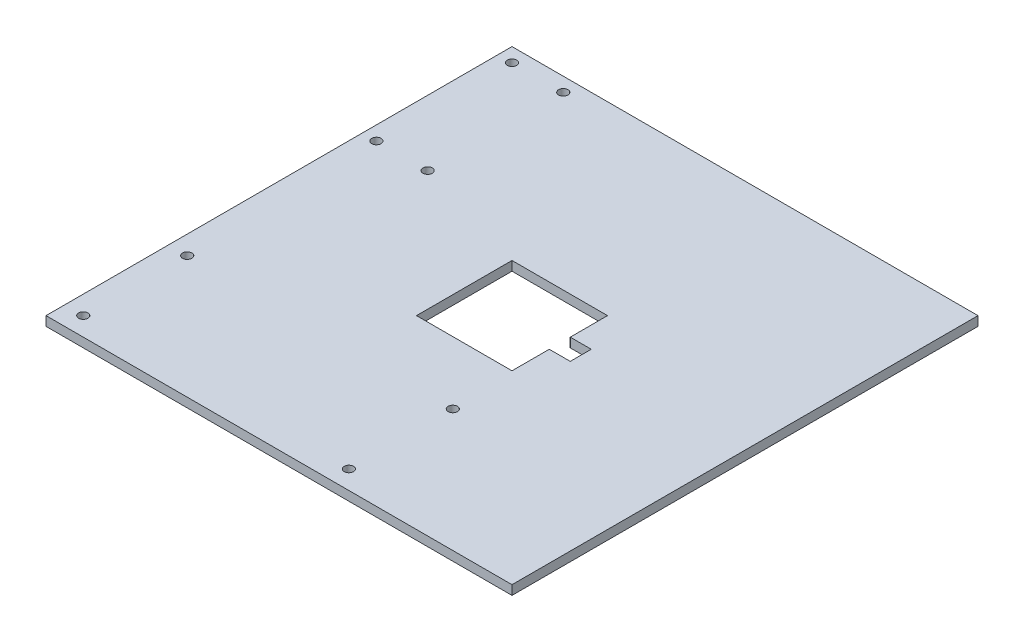
ISO-10303-21;
HEADER;
FILE_DESCRIPTION(('STEP AP214'),'2;1');
FILE_NAME('part.step','',(''),(''),'','','');
FILE_SCHEMA(('AUTOMOTIVE_DESIGN { 1 0 10303 214 1 1 1 1 }'));
ENDSEC;
DATA;
#1=APPLICATION_CONTEXT('core data for automotive mechanical design processes');
#2=APPLICATION_PROTOCOL_DEFINITION('international standard','automotive_design',2000,#1);
#3=PRODUCT_CONTEXT('',#1,'mechanical');
#4=PRODUCT('Part','Part','',(#3));
#5=PRODUCT_RELATED_PRODUCT_CATEGORY('part','',(#4));
#6=PRODUCT_DEFINITION_FORMATION('','',#4);
#7=PRODUCT_DEFINITION_CONTEXT('part definition',#1,'design');
#8=PRODUCT_DEFINITION('design','',#6,#7);
#9=PRODUCT_DEFINITION_SHAPE('','',#8);
#10=(LENGTH_UNIT() NAMED_UNIT(*) SI_UNIT(.MILLI.,.METRE.));
#11=(NAMED_UNIT(*) PLANE_ANGLE_UNIT() SI_UNIT($,.RADIAN.));
#12=(NAMED_UNIT(*) SI_UNIT($,.STERADIAN.) SOLID_ANGLE_UNIT());
#13=UNCERTAINTY_MEASURE_WITH_UNIT(LENGTH_MEASURE(1.E-05),#10,'distance_accuracy_value','');
#14=(GEOMETRIC_REPRESENTATION_CONTEXT(3) GLOBAL_UNCERTAINTY_ASSIGNED_CONTEXT((#13)) GLOBAL_UNIT_ASSIGNED_CONTEXT((#10,
#11,#12)) REPRESENTATION_CONTEXT('',''));
#15=CARTESIAN_POINT('',(0.,0.,0.));
#16=DIRECTION('',(0.,0.,1.));
#17=DIRECTION('',(1.,0.,0.));
#18=AXIS2_PLACEMENT_3D('',#15,#16,#17);
#19=CARTESIAN_POINT('',(0.,2.,0.));
#20=DIRECTION('',(0.,-1.,0.));
#21=DIRECTION('',(0.,0.,-1.));
#22=AXIS2_PLACEMENT_3D('',#19,#20,#21);
#23=PLANE('',#22);
#24=CARTESIAN_POINT('',(3.,2.,-97.));
#25=DIRECTION('',(0.,1.,0.));
#26=DIRECTION('',(0.,0.,1.));
#27=AXIS2_PLACEMENT_3D('',#24,#25,#26);
#28=CIRCLE('',#27,1.);
#29=CARTESIAN_POINT('',(3.,2.,-96.));
#30=VERTEX_POINT('',#29);
#31=EDGE_CURVE('E426',#30,#30,#28,.T.);
#32=ORIENTED_EDGE('',*,*,#31,.F.);
#33=EDGE_LOOP('',(#32));
#34=FACE_BOUND('',#33,.T.);
#35=CARTESIAN_POINT('',(14.,2.,-97.));
#36=DIRECTION('',(0.,1.,0.));
#37=DIRECTION('',(0.,0.,1.));
#38=AXIS2_PLACEMENT_3D('',#35,#36,#37);
#39=CIRCLE('',#38,1.);
#40=CARTESIAN_POINT('',(14.,2.,-96.));
#41=VERTEX_POINT('',#40);
#42=EDGE_CURVE('E428',#41,#41,#39,.T.);
#43=ORIENTED_EDGE('',*,*,#42,.F.);
#44=EDGE_LOOP('',(#43));
#45=FACE_BOUND('',#44,.T.);
#46=CARTESIAN_POINT('',(14.,2.,-67.9));
#47=DIRECTION('',(0.,1.,0.));
#48=DIRECTION('',(0.,0.,1.));
#49=AXIS2_PLACEMENT_3D('',#46,#47,#48);
#50=CIRCLE('',#49,1.);
#51=CARTESIAN_POINT('',(14.,2.,-66.9));
#52=VERTEX_POINT('',#51);
#53=EDGE_CURVE('E481',#52,#52,#50,.T.);
#54=ORIENTED_EDGE('',*,*,#53,.F.);
#55=EDGE_LOOP('',(#54));
#56=FACE_BOUND('',#55,.T.);
#57=CARTESIAN_POINT('',(3.,2.,-67.9));
#58=DIRECTION('',(0.,1.,0.));
#59=DIRECTION('',(0.,0.,1.));
#60=AXIS2_PLACEMENT_3D('',#57,#58,#59);
#61=CIRCLE('',#60,1.);
#62=CARTESIAN_POINT('',(3.,2.,-66.9));
#63=VERTEX_POINT('',#62);
#64=EDGE_CURVE('E436',#63,#63,#61,.T.);
#65=ORIENTED_EDGE('',*,*,#64,.F.);
#66=EDGE_LOOP('',(#65));
#67=FACE_BOUND('',#66,.T.);
#68=CARTESIAN_POINT('',(4.,2.,-4.));
#69=DIRECTION('',(0.,1.,0.));
#70=DIRECTION('',(0.,0.,1.));
#71=AXIS2_PLACEMENT_3D('',#68,#69,#70);
#72=CIRCLE('',#71,0.999999999999998);
#73=CARTESIAN_POINT('',(4.,2.,-3.));
#74=VERTEX_POINT('',#73);
#75=EDGE_CURVE('E450',#74,#74,#72,.T.);
#76=ORIENTED_EDGE('',*,*,#75,.F.);
#77=EDGE_LOOP('',(#76));
#78=FACE_BOUND('',#77,.T.);
#79=CARTESIAN_POINT('',(61.,2.,-26.3));
#80=DIRECTION('',(0.,1.,0.));
#81=DIRECTION('',(0.,0.,1.));
#82=AXIS2_PLACEMENT_3D('',#79,#80,#81);
#83=CIRCLE('',#82,0.999999999999998);
#84=CARTESIAN_POINT('',(61.,2.,-25.3));
#85=VERTEX_POINT('',#84);
#86=EDGE_CURVE('E443',#85,#85,#83,.T.);
#87=ORIENTED_EDGE('',*,*,#86,.F.);
#88=EDGE_LOOP('',(#87));
#89=FACE_BOUND('',#88,.T.);
#90=CARTESIAN_POINT('',(61.,2.,-4.));
#91=DIRECTION('',(0.,1.,0.));
#92=DIRECTION('',(0.,0.,1.));
#93=AXIS2_PLACEMENT_3D('',#90,#91,#92);
#94=CIRCLE('',#93,0.999999999999998);
#95=CARTESIAN_POINT('',(61.,2.,-3.));
#96=VERTEX_POINT('',#95);
#97=EDGE_CURVE('E435',#96,#96,#94,.T.);
#98=ORIENTED_EDGE('',*,*,#97,.F.);
#99=EDGE_LOOP('',(#98));
#100=FACE_BOUND('',#99,.T.);
#101=CARTESIAN_POINT('',(4.,2.,-26.3));
#102=DIRECTION('',(0.,1.,0.));
#103=DIRECTION('',(0.,0.,1.));
#104=AXIS2_PLACEMENT_3D('',#101,#102,#103);
#105=CIRCLE('',#104,0.999999999999998);
#106=CARTESIAN_POINT('',(4.,2.,-25.3));
#107=VERTEX_POINT('',#106);
#108=EDGE_CURVE('E449',#107,#107,#105,.T.);
#109=ORIENTED_EDGE('',*,*,#108,.F.);
#110=EDGE_LOOP('',(#109));
#111=FACE_BOUND('',#110,.T.);
#112=DIRECTION('',(0.,0.,1.));
#113=VECTOR('',#112,1.);
#114=CARTESIAN_POINT('',(0.,2.,0.));
#115=LINE('',#114,#113);
#116=CARTESIAN_POINT('',(0.,2.,-100.));
#117=VERTEX_POINT('',#116);
#118=CARTESIAN_POINT('',(0.,2.,0.));
#119=VERTEX_POINT('',#118);
#120=EDGE_CURVE('E191',#117,#119,#115,.T.);
#121=ORIENTED_EDGE('',*,*,#120,.T.);
#122=DIRECTION('',(1.,0.,0.));
#123=VECTOR('',#122,1.);
#124=CARTESIAN_POINT('',(0.,2.,0.));
#125=LINE('',#124,#123);
#126=CARTESIAN_POINT('',(100.,2.,0.));
#127=VERTEX_POINT('',#126);
#128=EDGE_CURVE('E194',#119,#127,#125,.T.);
#129=ORIENTED_EDGE('',*,*,#128,.T.);
#130=DIRECTION('',(0.,0.,-1.));
#131=VECTOR('',#130,1.);
#132=CARTESIAN_POINT('',(100.,2.,0.));
#133=LINE('',#132,#131);
#134=CARTESIAN_POINT('',(100.,2.,-100.));
#135=VERTEX_POINT('',#134);
#136=EDGE_CURVE('E197',#127,#135,#133,.T.);
#137=ORIENTED_EDGE('',*,*,#136,.T.);
#138=DIRECTION('',(-1.,0.,0.));
#139=VECTOR('',#138,1.);
#140=CARTESIAN_POINT('',(0.,2.,-100.));
#141=LINE('',#140,#139);
#142=EDGE_CURVE('E199',#135,#117,#141,.T.);
#143=ORIENTED_EDGE('',*,*,#142,.T.);
#144=EDGE_LOOP('',(#121,#129,#137,#143));
#145=FACE_BOUND('',#144,.T.);
#146=DIRECTION('',(0.,0.,1.));
#147=VECTOR('',#146,1.);
#148=CARTESIAN_POINT('',(60.25,2.,0.));
#149=LINE('',#148,#147);
#150=CARTESIAN_POINT('',(60.25,2.,-60.25));
#151=VERTEX_POINT('',#150);
#152=CARTESIAN_POINT('',(60.25,2.,-52.25));
#153=VERTEX_POINT('',#152);
#154=EDGE_CURVE('E47',#151,#153,#149,.T.);
#155=ORIENTED_EDGE('',*,*,#154,.T.);
#156=DIRECTION('',(1.,0.,0.));
#157=VECTOR('',#156,1.);
#158=CARTESIAN_POINT('',(1.61136536212957E-13,2.,-52.2500000000002));
#159=LINE('',#158,#157);
#160=CARTESIAN_POINT('',(64.75,2.,-52.25));
#161=VERTEX_POINT('',#160);
#162=EDGE_CURVE('E139',#153,#161,#159,.T.);
#163=ORIENTED_EDGE('',*,*,#162,.T.);
#164=DIRECTION('',(0.,0.,-1.));
#165=VECTOR('',#164,1.);
#166=CARTESIAN_POINT('',(64.75,2.,0.));
#167=LINE('',#166,#165);
#168=CARTESIAN_POINT('',(64.75,2.,-47.75));
#169=VERTEX_POINT('',#168);
#170=EDGE_CURVE('E143',#169,#161,#167,.T.);
#171=ORIENTED_EDGE('',*,*,#170,.F.);
#172=DIRECTION('',(1.,0.,0.));
#173=VECTOR('',#172,1.);
#174=CARTESIAN_POINT('',(0.,2.,-47.7499999999999));
#175=LINE('',#174,#173);
#176=CARTESIAN_POINT('',(60.25,2.,-47.75));
#177=VERTEX_POINT('',#176);
#178=EDGE_CURVE('E172',#177,#169,#175,.T.);
#179=ORIENTED_EDGE('',*,*,#178,.F.);
#180=CARTESIAN_POINT('',(60.25,2.,-39.75));
#181=VERTEX_POINT('',#180);
#182=EDGE_CURVE('E164',#177,#181,#149,.T.);
#183=ORIENTED_EDGE('',*,*,#182,.T.);
#184=DIRECTION('',(1.,0.,0.));
#185=VECTOR('',#184,1.);
#186=CARTESIAN_POINT('',(0.,2.,-39.75));
#187=LINE('',#186,#185);
#188=CARTESIAN_POINT('',(39.75,2.,-39.75));
#189=VERTEX_POINT('',#188);
#190=EDGE_CURVE('E169',#189,#181,#187,.T.);
#191=ORIENTED_EDGE('',*,*,#190,.F.);
#192=DIRECTION('',(0.,0.,1.));
#193=VECTOR('',#192,1.);
#194=CARTESIAN_POINT('',(39.75,2.,0.));
#195=LINE('',#194,#193);
#196=CARTESIAN_POINT('',(39.75,2.,-60.25));
#197=VERTEX_POINT('',#196);
#198=EDGE_CURVE('E166',#197,#189,#195,.T.);
#199=ORIENTED_EDGE('',*,*,#198,.F.);
#200=DIRECTION('',(1.,0.,0.));
#201=VECTOR('',#200,1.);
#202=CARTESIAN_POINT('',(0.,2.,-60.25));
#203=LINE('',#202,#201);
#204=EDGE_CURVE('E162',#197,#151,#203,.T.);
#205=ORIENTED_EDGE('',*,*,#204,.T.);
#206=EDGE_LOOP('',(#155,#163,#171,#179,#183,#191,#199,#205));
#207=FACE_BOUND('',#206,.T.);
#208=ADVANCED_FACE('F32',(#34,#45,#56,#67,#78,#89,#100,#111,#145,#207),#23,.F.);
#209=CARTESIAN_POINT('',(0.,0.,0.));
#210=DIRECTION('',(0.,-1.,0.));
#211=DIRECTION('',(0.,0.,-1.));
#212=AXIS2_PLACEMENT_3D('',#209,#210,#211);
#213=PLANE('',#212);
#214=CARTESIAN_POINT('',(3.,0.,-97.));
#215=DIRECTION('',(0.,1.,0.));
#216=DIRECTION('',(0.,0.,1.));
#217=AXIS2_PLACEMENT_3D('',#214,#215,#216);
#218=CIRCLE('',#217,1.);
#219=CARTESIAN_POINT('',(3.,0.,-96.));
#220=VERTEX_POINT('',#219);
#221=EDGE_CURVE('E424',#220,#220,#218,.T.);
#222=ORIENTED_EDGE('',*,*,#221,.T.);
#223=EDGE_LOOP('',(#222));
#224=FACE_BOUND('',#223,.T.);
#225=CARTESIAN_POINT('',(14.,0.,-97.));
#226=DIRECTION('',(0.,1.,0.));
#227=DIRECTION('',(0.,0.,1.));
#228=AXIS2_PLACEMENT_3D('',#225,#226,#227);
#229=CIRCLE('',#228,1.);
#230=CARTESIAN_POINT('',(14.,0.,-96.));
#231=VERTEX_POINT('',#230);
#232=EDGE_CURVE('E486',#231,#231,#229,.T.);
#233=ORIENTED_EDGE('',*,*,#232,.T.);
#234=EDGE_LOOP('',(#233));
#235=FACE_BOUND('',#234,.T.);
#236=CARTESIAN_POINT('',(14.,0.,-67.9));
#237=DIRECTION('',(0.,1.,0.));
#238=DIRECTION('',(0.,0.,1.));
#239=AXIS2_PLACEMENT_3D('',#236,#237,#238);
#240=CIRCLE('',#239,1.);
#241=CARTESIAN_POINT('',(14.,0.,-66.9));
#242=VERTEX_POINT('',#241);
#243=EDGE_CURVE('E439',#242,#242,#240,.T.);
#244=ORIENTED_EDGE('',*,*,#243,.T.);
#245=EDGE_LOOP('',(#244));
#246=FACE_BOUND('',#245,.T.);
#247=CARTESIAN_POINT('',(3.,0.,-67.9));
#248=DIRECTION('',(0.,1.,0.));
#249=DIRECTION('',(0.,0.,1.));
#250=AXIS2_PLACEMENT_3D('',#247,#248,#249);
#251=CIRCLE('',#250,1.);
#252=CARTESIAN_POINT('',(3.,0.,-66.9));
#253=VERTEX_POINT('',#252);
#254=EDGE_CURVE('E432',#253,#253,#251,.T.);
#255=ORIENTED_EDGE('',*,*,#254,.T.);
#256=EDGE_LOOP('',(#255));
#257=FACE_BOUND('',#256,.T.);
#258=CARTESIAN_POINT('',(4.,0.,-4.));
#259=DIRECTION('',(0.,1.,0.));
#260=DIRECTION('',(0.,0.,1.));
#261=AXIS2_PLACEMENT_3D('',#258,#259,#260);
#262=CIRCLE('',#261,0.999999999999998);
#263=CARTESIAN_POINT('',(4.,0.,-3.));
#264=VERTEX_POINT('',#263);
#265=EDGE_CURVE('E446',#264,#264,#262,.T.);
#266=ORIENTED_EDGE('',*,*,#265,.T.);
#267=EDGE_LOOP('',(#266));
#268=FACE_BOUND('',#267,.T.);
#269=CARTESIAN_POINT('',(61.,0.,-26.3));
#270=DIRECTION('',(0.,1.,0.));
#271=DIRECTION('',(0.,0.,1.));
#272=AXIS2_PLACEMENT_3D('',#269,#270,#271);
#273=CIRCLE('',#272,0.999999999999998);
#274=CARTESIAN_POINT('',(61.,0.,-25.3));
#275=VERTEX_POINT('',#274);
#276=EDGE_CURVE('E453',#275,#275,#273,.T.);
#277=ORIENTED_EDGE('',*,*,#276,.T.);
#278=EDGE_LOOP('',(#277));
#279=FACE_BOUND('',#278,.T.);
#280=CARTESIAN_POINT('',(61.,0.,-4.));
#281=DIRECTION('',(0.,1.,0.));
#282=DIRECTION('',(0.,0.,1.));
#283=AXIS2_PLACEMENT_3D('',#280,#281,#282);
#284=CIRCLE('',#283,0.999999999999998);
#285=CARTESIAN_POINT('',(61.,0.,-3.));
#286=VERTEX_POINT('',#285);
#287=EDGE_CURVE('E440',#286,#286,#284,.T.);
#288=ORIENTED_EDGE('',*,*,#287,.T.);
#289=EDGE_LOOP('',(#288));
#290=FACE_BOUND('',#289,.T.);
#291=CARTESIAN_POINT('',(4.,0.,-26.3));
#292=DIRECTION('',(0.,1.,0.));
#293=DIRECTION('',(0.,0.,1.));
#294=AXIS2_PLACEMENT_3D('',#291,#292,#293);
#295=CIRCLE('',#294,0.999999999999998);
#296=CARTESIAN_POINT('',(4.,0.,-25.3));
#297=VERTEX_POINT('',#296);
#298=EDGE_CURVE('E163',#297,#297,#295,.T.);
#299=ORIENTED_EDGE('',*,*,#298,.T.);
#300=EDGE_LOOP('',(#299));
#301=FACE_BOUND('',#300,.T.);
#302=DIRECTION('',(0.,0.,1.));
#303=VECTOR('',#302,1.);
#304=CARTESIAN_POINT('',(0.,0.,0.));
#305=LINE('',#304,#303);
#306=CARTESIAN_POINT('',(0.,0.,-100.));
#307=VERTEX_POINT('',#306);
#308=CARTESIAN_POINT('',(0.,0.,0.));
#309=VERTEX_POINT('',#308);
#310=EDGE_CURVE('E179',#307,#309,#305,.T.);
#311=ORIENTED_EDGE('',*,*,#310,.F.);
#312=DIRECTION('',(-1.,0.,0.));
#313=VECTOR('',#312,1.);
#314=CARTESIAN_POINT('',(0.,0.,-100.));
#315=LINE('',#314,#313);
#316=CARTESIAN_POINT('',(100.,0.,-100.));
#317=VERTEX_POINT('',#316);
#318=EDGE_CURVE('E195',#317,#307,#315,.T.);
#319=ORIENTED_EDGE('',*,*,#318,.F.);
#320=DIRECTION('',(0.,0.,-1.));
#321=VECTOR('',#320,1.);
#322=CARTESIAN_POINT('',(100.,0.,0.));
#323=LINE('',#322,#321);
#324=CARTESIAN_POINT('',(100.,0.,0.));
#325=VERTEX_POINT('',#324);
#326=EDGE_CURVE('E206',#325,#317,#323,.T.);
#327=ORIENTED_EDGE('',*,*,#326,.F.);
#328=DIRECTION('',(1.,0.,0.));
#329=VECTOR('',#328,1.);
#330=CARTESIAN_POINT('',(0.,0.,0.));
#331=LINE('',#330,#329);
#332=EDGE_CURVE('E204',#309,#325,#331,.T.);
#333=ORIENTED_EDGE('',*,*,#332,.F.);
#334=EDGE_LOOP('',(#311,#319,#327,#333));
#335=FACE_BOUND('',#334,.T.);
#336=DIRECTION('',(1.,0.,0.));
#337=VECTOR('',#336,1.);
#338=CARTESIAN_POINT('',(1.61136536212957E-13,0.,-52.2500000000002));
#339=LINE('',#338,#337);
#340=CARTESIAN_POINT('',(60.25,0.,-52.25));
#341=VERTEX_POINT('',#340);
#342=CARTESIAN_POINT('',(64.75,0.,-52.25));
#343=VERTEX_POINT('',#342);
#344=EDGE_CURVE('E134',#341,#343,#339,.T.);
#345=ORIENTED_EDGE('',*,*,#344,.F.);
#346=DIRECTION('',(0.,0.,1.));
#347=VECTOR('',#346,1.);
#348=CARTESIAN_POINT('',(60.25,0.,0.));
#349=LINE('',#348,#347);
#350=CARTESIAN_POINT('',(60.25,0.,-60.25));
#351=VERTEX_POINT('',#350);
#352=EDGE_CURVE('E130',#351,#341,#349,.T.);
#353=ORIENTED_EDGE('',*,*,#352,.F.);
#354=DIRECTION('',(1.,0.,0.));
#355=VECTOR('',#354,1.);
#356=CARTESIAN_POINT('',(0.,0.,-60.25));
#357=LINE('',#356,#355);
#358=CARTESIAN_POINT('',(39.75,0.,-60.25));
#359=VERTEX_POINT('',#358);
#360=EDGE_CURVE('E122',#359,#351,#357,.T.);
#361=ORIENTED_EDGE('',*,*,#360,.F.);
#362=DIRECTION('',(0.,0.,1.));
#363=VECTOR('',#362,1.);
#364=CARTESIAN_POINT('',(39.75,0.,0.));
#365=LINE('',#364,#363);
#366=CARTESIAN_POINT('',(39.75,0.,-39.75));
#367=VERTEX_POINT('',#366);
#368=EDGE_CURVE('E55',#359,#367,#365,.T.);
#369=ORIENTED_EDGE('',*,*,#368,.T.);
#370=DIRECTION('',(1.,0.,0.));
#371=VECTOR('',#370,1.);
#372=CARTESIAN_POINT('',(0.,0.,-39.75));
#373=LINE('',#372,#371);
#374=CARTESIAN_POINT('',(60.25,0.,-39.75));
#375=VERTEX_POINT('',#374);
#376=EDGE_CURVE('E147',#367,#375,#373,.T.);
#377=ORIENTED_EDGE('',*,*,#376,.T.);
#378=CARTESIAN_POINT('',(60.25,0.,-47.75));
#379=VERTEX_POINT('',#378);
#380=EDGE_CURVE('E141',#379,#375,#349,.T.);
#381=ORIENTED_EDGE('',*,*,#380,.F.);
#382=DIRECTION('',(1.,0.,0.));
#383=VECTOR('',#382,1.);
#384=CARTESIAN_POINT('',(0.,0.,-47.7499999999999));
#385=LINE('',#384,#383);
#386=CARTESIAN_POINT('',(64.75,0.,-47.75));
#387=VERTEX_POINT('',#386);
#388=EDGE_CURVE('E146',#379,#387,#385,.T.);
#389=ORIENTED_EDGE('',*,*,#388,.T.);
#390=DIRECTION('',(0.,0.,-1.));
#391=VECTOR('',#390,1.);
#392=CARTESIAN_POINT('',(64.75,0.,0.));
#393=LINE('',#392,#391);
#394=EDGE_CURVE('E152',#387,#343,#393,.T.);
#395=ORIENTED_EDGE('',*,*,#394,.T.);
#396=EDGE_LOOP('',(#345,#353,#361,#369,#377,#381,#389,#395));
#397=FACE_BOUND('',#396,.T.);
#398=ADVANCED_FACE('F137',(#224,#235,#246,#257,#268,#279,#290,#301,#335,#397),#213,.T.);
#399=CARTESIAN_POINT('',(0.,2.,0.));
#400=DIRECTION('',(1.,0.,0.));
#401=DIRECTION('',(0.,0.,-1.));
#402=AXIS2_PLACEMENT_3D('',#399,#400,#401);
#403=PLANE('',#402);
#404=ORIENTED_EDGE('',*,*,#310,.T.);
#405=DIRECTION('',(0.,-1.,0.));
#406=VECTOR('',#405,1.);
#407=CARTESIAN_POINT('',(0.,2.,0.));
#408=LINE('',#407,#406);
#409=EDGE_CURVE('E11',#119,#309,#408,.T.);
#410=ORIENTED_EDGE('',*,*,#409,.F.);
#411=ORIENTED_EDGE('',*,*,#120,.F.);
#412=DIRECTION('',(0.,-1.,0.));
#413=VECTOR('',#412,1.);
#414=CARTESIAN_POINT('',(0.,2.,-100.));
#415=LINE('',#414,#413);
#416=EDGE_CURVE('E201',#117,#307,#415,.T.);
#417=ORIENTED_EDGE('',*,*,#416,.T.);
#418=EDGE_LOOP('',(#404,#410,#411,#417));
#419=FACE_BOUND('',#418,.T.);
#420=ADVANCED_FACE('F34',(#419),#403,.F.);
#421=CARTESIAN_POINT('',(0.,2.,0.));
#422=DIRECTION('',(0.,0.,-1.));
#423=DIRECTION('',(-1.,0.,0.));
#424=AXIS2_PLACEMENT_3D('',#421,#422,#423);
#425=PLANE('',#424);
#426=ORIENTED_EDGE('',*,*,#332,.T.);
#427=DIRECTION('',(0.,-1.,0.));
#428=VECTOR('',#427,1.);
#429=CARTESIAN_POINT('',(100.,2.,0.));
#430=LINE('',#429,#428);
#431=EDGE_CURVE('E40',#127,#325,#430,.T.);
#432=ORIENTED_EDGE('',*,*,#431,.F.);
#433=ORIENTED_EDGE('',*,*,#128,.F.);
#434=ORIENTED_EDGE('',*,*,#409,.T.);
#435=EDGE_LOOP('',(#426,#432,#433,#434));
#436=FACE_BOUND('',#435,.T.);
#437=ADVANCED_FACE('F233',(#436),#425,.F.);
#438=CARTESIAN_POINT('',(100.,2.,0.));
#439=DIRECTION('',(-1.,0.,0.));
#440=DIRECTION('',(0.,0.,1.));
#441=AXIS2_PLACEMENT_3D('',#438,#439,#440);
#442=PLANE('',#441);
#443=ORIENTED_EDGE('',*,*,#326,.T.);
#444=DIRECTION('',(0.,-1.,0.));
#445=VECTOR('',#444,1.);
#446=CARTESIAN_POINT('',(100.,2.,-100.));
#447=LINE('',#446,#445);
#448=EDGE_CURVE('E211',#135,#317,#447,.T.);
#449=ORIENTED_EDGE('',*,*,#448,.F.);
#450=ORIENTED_EDGE('',*,*,#136,.F.);
#451=ORIENTED_EDGE('',*,*,#431,.T.);
#452=EDGE_LOOP('',(#443,#449,#450,#451));
#453=FACE_BOUND('',#452,.T.);
#454=ADVANCED_FACE('F218',(#453),#442,.F.);
#455=CARTESIAN_POINT('',(0.,2.,-100.));
#456=DIRECTION('',(0.,0.,1.));
#457=DIRECTION('',(1.,0.,0.));
#458=AXIS2_PLACEMENT_3D('',#455,#456,#457);
#459=PLANE('',#458);
#460=ORIENTED_EDGE('',*,*,#318,.T.);
#461=ORIENTED_EDGE('',*,*,#416,.F.);
#462=ORIENTED_EDGE('',*,*,#142,.F.);
#463=ORIENTED_EDGE('',*,*,#448,.T.);
#464=EDGE_LOOP('',(#460,#461,#462,#463));
#465=FACE_BOUND('',#464,.T.);
#466=ADVANCED_FACE('F226',(#465),#459,.F.);
#467=CARTESIAN_POINT('',(60.25,0.,0.));
#468=DIRECTION('',(-1.,0.,0.));
#469=DIRECTION('',(0.,0.,1.));
#470=AXIS2_PLACEMENT_3D('',#467,#468,#469);
#471=PLANE('',#470);
#472=ORIENTED_EDGE('',*,*,#154,.F.);
#473=DIRECTION('',(0.,1.,0.));
#474=VECTOR('',#473,1.);
#475=CARTESIAN_POINT('',(60.25,0.,-60.25));
#476=LINE('',#475,#474);
#477=EDGE_CURVE('E125',#351,#151,#476,.T.);
#478=ORIENTED_EDGE('',*,*,#477,.F.);
#479=ORIENTED_EDGE('',*,*,#352,.T.);
#480=DIRECTION('',(0.,1.,0.));
#481=VECTOR('',#480,1.);
#482=CARTESIAN_POINT('',(60.25,0.,-52.25));
#483=LINE('',#482,#481);
#484=EDGE_CURVE('E177',#341,#153,#483,.T.);
#485=ORIENTED_EDGE('',*,*,#484,.T.);
#486=EDGE_LOOP('',(#472,#478,#479,#485));
#487=FACE_BOUND('',#486,.T.);
#488=ADVANCED_FACE('F132',(#487),#471,.T.);
#489=CARTESIAN_POINT('',(1.61136536212957E-13,0.,-52.2500000000002));
#490=DIRECTION('',(0.,0.,1.));
#491=DIRECTION('',(1.,0.,0.));
#492=AXIS2_PLACEMENT_3D('',#489,#490,#491);
#493=PLANE('',#492);
#494=ORIENTED_EDGE('',*,*,#162,.F.);
#495=ORIENTED_EDGE('',*,*,#484,.F.);
#496=ORIENTED_EDGE('',*,*,#344,.T.);
#497=DIRECTION('',(0.,1.,0.));
#498=VECTOR('',#497,1.);
#499=CARTESIAN_POINT('',(64.75,0.,-52.25));
#500=LINE('',#499,#498);
#501=EDGE_CURVE('E180',#343,#161,#500,.T.);
#502=ORIENTED_EDGE('',*,*,#501,.T.);
#503=EDGE_LOOP('',(#494,#495,#496,#502));
#504=FACE_BOUND('',#503,.T.);
#505=ADVANCED_FACE('F257',(#504),#493,.T.);
#506=CARTESIAN_POINT('',(64.75,0.,0.));
#507=DIRECTION('',(1.,0.,0.));
#508=DIRECTION('',(0.,0.,-1.));
#509=AXIS2_PLACEMENT_3D('',#506,#507,#508);
#510=PLANE('',#509);
#511=ORIENTED_EDGE('',*,*,#170,.T.);
#512=ORIENTED_EDGE('',*,*,#501,.F.);
#513=ORIENTED_EDGE('',*,*,#394,.F.);
#514=DIRECTION('',(0.,1.,0.));
#515=VECTOR('',#514,1.);
#516=CARTESIAN_POINT('',(64.75,0.,-47.75));
#517=LINE('',#516,#515);
#518=EDGE_CURVE('E182',#387,#169,#517,.T.);
#519=ORIENTED_EDGE('',*,*,#518,.T.);
#520=EDGE_LOOP('',(#511,#512,#513,#519));
#521=FACE_BOUND('',#520,.T.);
#522=ADVANCED_FACE('F263',(#521),#510,.F.);
#523=CARTESIAN_POINT('',(0.,0.,-47.7499999999999));
#524=DIRECTION('',(0.,0.,1.));
#525=DIRECTION('',(1.,0.,0.));
#526=AXIS2_PLACEMENT_3D('',#523,#524,#525);
#527=PLANE('',#526);
#528=ORIENTED_EDGE('',*,*,#178,.T.);
#529=ORIENTED_EDGE('',*,*,#518,.F.);
#530=ORIENTED_EDGE('',*,*,#388,.F.);
#531=DIRECTION('',(0.,1.,0.));
#532=VECTOR('',#531,1.);
#533=CARTESIAN_POINT('',(60.25,0.,-47.75));
#534=LINE('',#533,#532);
#535=EDGE_CURVE('E184',#379,#177,#534,.T.);
#536=ORIENTED_EDGE('',*,*,#535,.T.);
#537=EDGE_LOOP('',(#528,#529,#530,#536));
#538=FACE_BOUND('',#537,.T.);
#539=ADVANCED_FACE('F270',(#538),#527,.F.);
#540=ORIENTED_EDGE('',*,*,#182,.F.);
#541=ORIENTED_EDGE('',*,*,#535,.F.);
#542=ORIENTED_EDGE('',*,*,#380,.T.);
#543=DIRECTION('',(0.,1.,0.));
#544=VECTOR('',#543,1.);
#545=CARTESIAN_POINT('',(60.25,0.,-39.75));
#546=LINE('',#545,#544);
#547=EDGE_CURVE('E186',#375,#181,#546,.T.);
#548=ORIENTED_EDGE('',*,*,#547,.T.);
#549=EDGE_LOOP('',(#540,#541,#542,#548));
#550=FACE_BOUND('',#549,.T.);
#551=ADVANCED_FACE('F259',(#550),#471,.T.);
#552=CARTESIAN_POINT('',(0.,0.,-39.75));
#553=DIRECTION('',(0.,0.,1.));
#554=DIRECTION('',(1.,0.,0.));
#555=AXIS2_PLACEMENT_3D('',#552,#553,#554);
#556=PLANE('',#555);
#557=ORIENTED_EDGE('',*,*,#190,.T.);
#558=ORIENTED_EDGE('',*,*,#547,.F.);
#559=ORIENTED_EDGE('',*,*,#376,.F.);
#560=DIRECTION('',(0.,1.,0.));
#561=VECTOR('',#560,1.);
#562=CARTESIAN_POINT('',(39.75,0.,-39.75));
#563=LINE('',#562,#561);
#564=EDGE_CURVE('E188',#367,#189,#563,.T.);
#565=ORIENTED_EDGE('',*,*,#564,.T.);
#566=EDGE_LOOP('',(#557,#558,#559,#565));
#567=FACE_BOUND('',#566,.T.);
#568=ADVANCED_FACE('F269',(#567),#556,.F.);
#569=CARTESIAN_POINT('',(39.75,0.,0.));
#570=DIRECTION('',(-1.,0.,0.));
#571=DIRECTION('',(0.,0.,1.));
#572=AXIS2_PLACEMENT_3D('',#569,#570,#571);
#573=PLANE('',#572);
#574=ORIENTED_EDGE('',*,*,#198,.T.);
#575=ORIENTED_EDGE('',*,*,#564,.F.);
#576=ORIENTED_EDGE('',*,*,#368,.F.);
#577=DIRECTION('',(0.,1.,0.));
#578=VECTOR('',#577,1.);
#579=CARTESIAN_POINT('',(39.75,0.,-60.25));
#580=LINE('',#579,#578);
#581=EDGE_CURVE('E127',#359,#197,#580,.T.);
#582=ORIENTED_EDGE('',*,*,#581,.T.);
#583=EDGE_LOOP('',(#574,#575,#576,#582));
#584=FACE_BOUND('',#583,.T.);
#585=ADVANCED_FACE('F275',(#584),#573,.F.);
#586=CARTESIAN_POINT('',(0.,0.,-60.25));
#587=DIRECTION('',(0.,0.,1.));
#588=DIRECTION('',(1.,0.,0.));
#589=AXIS2_PLACEMENT_3D('',#586,#587,#588);
#590=PLANE('',#589);
#591=ORIENTED_EDGE('',*,*,#204,.F.);
#592=ORIENTED_EDGE('',*,*,#581,.F.);
#593=ORIENTED_EDGE('',*,*,#360,.T.);
#594=ORIENTED_EDGE('',*,*,#477,.T.);
#595=EDGE_LOOP('',(#591,#592,#593,#594));
#596=FACE_BOUND('',#595,.T.);
#597=ADVANCED_FACE('F124',(#596),#590,.T.);
#598=CARTESIAN_POINT('',(4.,0.,-26.3));
#599=DIRECTION('',(0.,1.,0.));
#600=DIRECTION('',(0.,0.,1.));
#601=AXIS2_PLACEMENT_3D('',#598,#599,#600);
#602=CYLINDRICAL_SURFACE('',#601,0.999999999999998);
#603=ORIENTED_EDGE('',*,*,#298,.F.);
#604=EDGE_LOOP('',(#603));
#605=FACE_BOUND('',#604,.T.);
#606=ORIENTED_EDGE('',*,*,#108,.T.);
#607=EDGE_LOOP('',(#606));
#608=FACE_BOUND('',#607,.T.);
#609=ADVANCED_FACE('F292',(#605,#608),#602,.F.);
#610=CARTESIAN_POINT('',(61.,0.,-4.));
#611=DIRECTION('',(0.,1.,0.));
#612=DIRECTION('',(0.,0.,1.));
#613=AXIS2_PLACEMENT_3D('',#610,#611,#612);
#614=CYLINDRICAL_SURFACE('',#613,0.999999999999998);
#615=ORIENTED_EDGE('',*,*,#287,.F.);
#616=EDGE_LOOP('',(#615));
#617=FACE_BOUND('',#616,.T.);
#618=ORIENTED_EDGE('',*,*,#97,.T.);
#619=EDGE_LOOP('',(#618));
#620=FACE_BOUND('',#619,.T.);
#621=ADVANCED_FACE('F296',(#617,#620),#614,.F.);
#622=CARTESIAN_POINT('',(61.,0.,-26.3));
#623=DIRECTION('',(0.,1.,0.));
#624=DIRECTION('',(0.,0.,1.));
#625=AXIS2_PLACEMENT_3D('',#622,#623,#624);
#626=CYLINDRICAL_SURFACE('',#625,0.999999999999998);
#627=ORIENTED_EDGE('',*,*,#276,.F.);
#628=EDGE_LOOP('',(#627));
#629=FACE_BOUND('',#628,.T.);
#630=ORIENTED_EDGE('',*,*,#86,.T.);
#631=EDGE_LOOP('',(#630));
#632=FACE_BOUND('',#631,.T.);
#633=ADVANCED_FACE('F302',(#629,#632),#626,.F.);
#634=CARTESIAN_POINT('',(4.,0.,-4.));
#635=DIRECTION('',(0.,1.,0.));
#636=DIRECTION('',(0.,0.,1.));
#637=AXIS2_PLACEMENT_3D('',#634,#635,#636);
#638=CYLINDRICAL_SURFACE('',#637,0.999999999999998);
#639=ORIENTED_EDGE('',*,*,#265,.F.);
#640=EDGE_LOOP('',(#639));
#641=FACE_BOUND('',#640,.T.);
#642=ORIENTED_EDGE('',*,*,#75,.T.);
#643=EDGE_LOOP('',(#642));
#644=FACE_BOUND('',#643,.T.);
#645=ADVANCED_FACE('F357',(#641,#644),#638,.F.);
#646=CARTESIAN_POINT('',(3.,0.,-67.9));
#647=DIRECTION('',(0.,1.,0.));
#648=DIRECTION('',(0.,0.,1.));
#649=AXIS2_PLACEMENT_3D('',#646,#647,#648);
#650=CYLINDRICAL_SURFACE('',#649,1.);
#651=ORIENTED_EDGE('',*,*,#254,.F.);
#652=EDGE_LOOP('',(#651));
#653=FACE_BOUND('',#652,.T.);
#654=ORIENTED_EDGE('',*,*,#64,.T.);
#655=EDGE_LOOP('',(#654));
#656=FACE_BOUND('',#655,.T.);
#657=ADVANCED_FACE('F365',(#653,#656),#650,.F.);
#658=CARTESIAN_POINT('',(14.,0.,-67.9));
#659=DIRECTION('',(0.,1.,0.));
#660=DIRECTION('',(0.,0.,1.));
#661=AXIS2_PLACEMENT_3D('',#658,#659,#660);
#662=CYLINDRICAL_SURFACE('',#661,1.);
#663=ORIENTED_EDGE('',*,*,#243,.F.);
#664=EDGE_LOOP('',(#663));
#665=FACE_BOUND('',#664,.T.);
#666=ORIENTED_EDGE('',*,*,#53,.T.);
#667=EDGE_LOOP('',(#666));
#668=FACE_BOUND('',#667,.T.);
#669=ADVANCED_FACE('F387',(#665,#668),#662,.F.);
#670=CARTESIAN_POINT('',(14.,0.,-97.));
#671=DIRECTION('',(0.,1.,0.));
#672=DIRECTION('',(0.,0.,1.));
#673=AXIS2_PLACEMENT_3D('',#670,#671,#672);
#674=CYLINDRICAL_SURFACE('',#673,1.);
#675=ORIENTED_EDGE('',*,*,#232,.F.);
#676=EDGE_LOOP('',(#675));
#677=FACE_BOUND('',#676,.T.);
#678=ORIENTED_EDGE('',*,*,#42,.T.);
#679=EDGE_LOOP('',(#678));
#680=FACE_BOUND('',#679,.T.);
#681=ADVANCED_FACE('F397',(#677,#680),#674,.F.);
#682=CARTESIAN_POINT('',(3.,0.,-97.));
#683=DIRECTION('',(0.,1.,0.));
#684=DIRECTION('',(0.,0.,1.));
#685=AXIS2_PLACEMENT_3D('',#682,#683,#684);
#686=CYLINDRICAL_SURFACE('',#685,1.);
#687=ORIENTED_EDGE('',*,*,#221,.F.);
#688=EDGE_LOOP('',(#687));
#689=FACE_BOUND('',#688,.T.);
#690=ORIENTED_EDGE('',*,*,#31,.T.);
#691=EDGE_LOOP('',(#690));
#692=FACE_BOUND('',#691,.T.);
#693=ADVANCED_FACE('F407',(#689,#692),#686,.F.);
#694=CLOSED_SHELL('',(#208,#398,#420,#437,#454,#466,#488,#505,#522,#539,#551,#568,#585,#597,
#609,#621,#633,#645,#657,#669,#681,#693));
#695=MANIFOLD_SOLID_BREP('B2',#694);
#696=ADVANCED_BREP_SHAPE_REPRESENTATION('',(#18,#695),#14);
#697=SHAPE_DEFINITION_REPRESENTATION(#9,#696);
ENDSEC;
END-ISO-10303-21;
